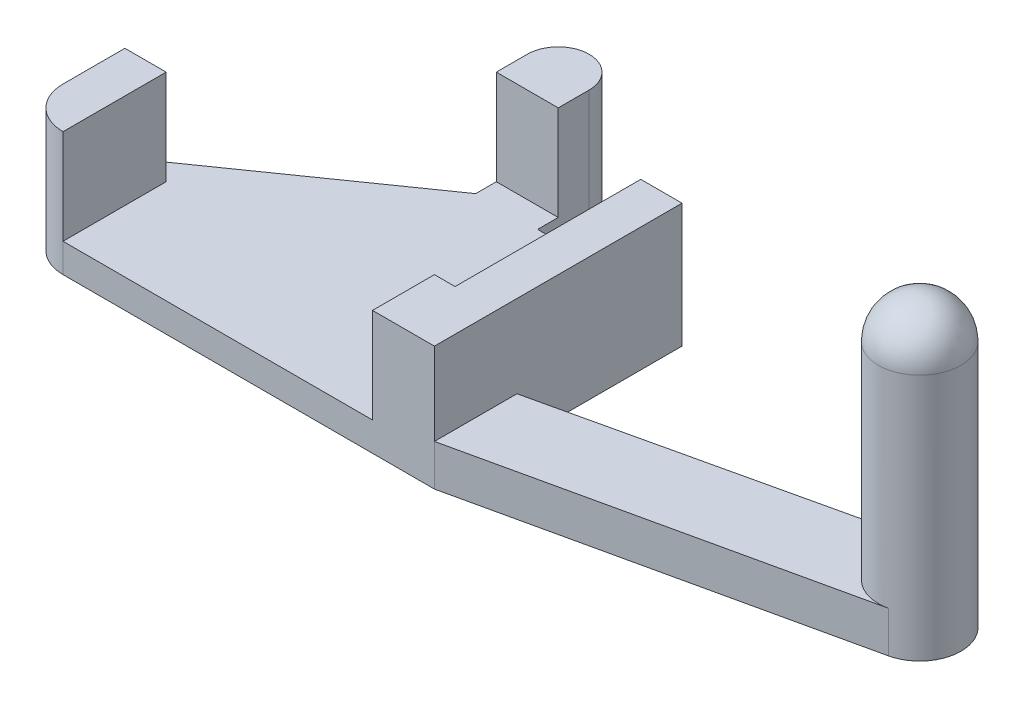
ISO-10303-21;
HEADER;
FILE_DESCRIPTION(('STEP AP214'),'2;1');
FILE_NAME('part.step','',(''),(''),'','','');
FILE_SCHEMA(('AUTOMOTIVE_DESIGN { 1 0 10303 214 1 1 1 1 }'));
ENDSEC;
DATA;
#1=APPLICATION_CONTEXT('core data for automotive mechanical design processes');
#2=APPLICATION_PROTOCOL_DEFINITION('international standard','automotive_design',2000,#1);
#3=PRODUCT_CONTEXT('',#1,'mechanical');
#4=PRODUCT('Part','Part','',(#3));
#5=PRODUCT_RELATED_PRODUCT_CATEGORY('part','',(#4));
#6=PRODUCT_DEFINITION_FORMATION('','',#4);
#7=PRODUCT_DEFINITION_CONTEXT('part definition',#1,'design');
#8=PRODUCT_DEFINITION('design','',#6,#7);
#9=PRODUCT_DEFINITION_SHAPE('','',#8);
#10=(LENGTH_UNIT() NAMED_UNIT(*) SI_UNIT(.MILLI.,.METRE.));
#11=(NAMED_UNIT(*) PLANE_ANGLE_UNIT() SI_UNIT($,.RADIAN.));
#12=(NAMED_UNIT(*) SI_UNIT($,.STERADIAN.) SOLID_ANGLE_UNIT());
#13=UNCERTAINTY_MEASURE_WITH_UNIT(LENGTH_MEASURE(1.E-05),#10,'distance_accuracy_value','');
#14=(GEOMETRIC_REPRESENTATION_CONTEXT(3) GLOBAL_UNCERTAINTY_ASSIGNED_CONTEXT((#13)) GLOBAL_UNIT_ASSIGNED_CONTEXT((#10,
#11,#12)) REPRESENTATION_CONTEXT('',''));
#15=CARTESIAN_POINT('',(0.,0.,0.));
#16=DIRECTION('',(0.,0.,1.));
#17=DIRECTION('',(1.,0.,0.));
#18=AXIS2_PLACEMENT_3D('',#15,#16,#17);
#19=CARTESIAN_POINT('',(-55.,0.,-50.));
#20=DIRECTION('',(0.,0.,1.));
#21=DIRECTION('',(1.,0.,0.));
#22=AXIS2_PLACEMENT_3D('',#19,#20,#21);
#23=PLANE('',#22);
#24=DIRECTION('',(0.,-1.,0.));
#25=VECTOR('',#24,1.);
#26=CARTESIAN_POINT('',(-80.,7.,-50.));
#27=LINE('',#26,#25);
#28=CARTESIAN_POINT('',(-80.,7.,-50.));
#29=VERTEX_POINT('',#28);
#30=CARTESIAN_POINT('',(-80.,0.,-50.));
#31=VERTEX_POINT('',#30);
#32=EDGE_CURVE('E55',#29,#31,#27,.T.);
#33=ORIENTED_EDGE('',*,*,#32,.F.);
#34=DIRECTION('',(1.,0.,0.));
#35=VECTOR('',#34,1.);
#36=CARTESIAN_POINT('',(-145.,7.,-50.));
#37=LINE('',#36,#35);
#38=CARTESIAN_POINT('',(-55.,7.,-50.));
#39=VERTEX_POINT('',#38);
#40=EDGE_CURVE('E233',#29,#39,#37,.T.);
#41=ORIENTED_EDGE('',*,*,#40,.T.);
#42=DIRECTION('',(0.,-1.,0.));
#43=VECTOR('',#42,1.);
#44=CARTESIAN_POINT('',(-55.,0.,-50.));
#45=LINE('',#44,#43);
#46=CARTESIAN_POINT('',(-55.,30.,-50.));
#47=VERTEX_POINT('',#46);
#48=EDGE_CURVE('E517',#47,#39,#45,.T.);
#49=ORIENTED_EDGE('',*,*,#48,.F.);
#50=DIRECTION('',(1.,0.,0.));
#51=VECTOR('',#50,1.);
#52=CARTESIAN_POINT('',(-55.,30.,-50.));
#53=LINE('',#52,#51);
#54=CARTESIAN_POINT('',(-45.,30.,-50.));
#55=VERTEX_POINT('',#54);
#56=EDGE_CURVE('E513',#47,#55,#53,.T.);
#57=ORIENTED_EDGE('',*,*,#56,.T.);
#58=DIRECTION('',(0.,-1.,0.));
#59=VECTOR('',#58,1.);
#60=CARTESIAN_POINT('',(-45.,0.,-50.));
#61=LINE('',#60,#59);
#62=CARTESIAN_POINT('',(-45.,0.,-50.));
#63=VERTEX_POINT('',#62);
#64=EDGE_CURVE('E523',#55,#63,#61,.T.);
#65=ORIENTED_EDGE('',*,*,#64,.T.);
#66=DIRECTION('',(1.,0.,0.));
#67=VECTOR('',#66,1.);
#68=CARTESIAN_POINT('',(-55.,0.,-50.));
#69=LINE('',#68,#67);
#70=EDGE_CURVE('E465',#31,#63,#69,.T.);
#71=ORIENTED_EDGE('',*,*,#70,.F.);
#72=EDGE_LOOP('',(#33,#41,#49,#57,#65,#71));
#73=FACE_BOUND('',#72,.T.);
#74=ADVANCED_FACE('F39',(#73),#23,.F.);
#75=CARTESIAN_POINT('',(-145.,7.,-50.));
#76=DIRECTION('',(0.,-1.,0.));
#77=DIRECTION('',(0.,0.,-1.));
#78=AXIS2_PLACEMENT_3D('',#75,#76,#77);
#79=PLANE('',#78);
#80=DIRECTION('',(0.,0.,1.));
#81=VECTOR('',#80,1.);
#82=CARTESIAN_POINT('',(-95.,7.,-55.));
#83=LINE('',#82,#81);
#84=CARTESIAN_POINT('',(-95.,7.,-55.));
#85=VERTEX_POINT('',#84);
#86=CARTESIAN_POINT('',(-95.,7.,-50.));
#87=VERTEX_POINT('',#86);
#88=EDGE_CURVE('E197',#85,#87,#83,.T.);
#89=ORIENTED_EDGE('',*,*,#88,.T.);
#90=DIRECTION('',(0.81923192051904,0.,-0.573462344363329));
#91=VECTOR('',#90,1.);
#92=CARTESIAN_POINT('',(-95.,7.,-50.));
#93=LINE('',#92,#91);
#94=CARTESIAN_POINT('',(-145.,7.,-15.));
#95=VERTEX_POINT('',#94);
#96=EDGE_CURVE('E63',#95,#87,#93,.T.);
#97=ORIENTED_EDGE('',*,*,#96,.F.);
#98=DIRECTION('',(-1.,0.,0.));
#99=VECTOR('',#98,1.);
#100=CARTESIAN_POINT('',(-145.,7.,-15.));
#101=LINE('',#100,#99);
#102=CARTESIAN_POINT('',(-135.,7.,-15.));
#103=VERTEX_POINT('',#102);
#104=EDGE_CURVE('E195',#103,#95,#101,.T.);
#105=ORIENTED_EDGE('',*,*,#104,.F.);
#106=DIRECTION('',(0.,0.,-1.));
#107=VECTOR('',#106,1.);
#108=CARTESIAN_POINT('',(-135.,7.,10.));
#109=LINE('',#108,#107);
#110=CARTESIAN_POINT('',(-135.,7.,10.));
#111=VERTEX_POINT('',#110);
#112=EDGE_CURVE('E210',#111,#103,#109,.T.);
#113=ORIENTED_EDGE('',*,*,#112,.F.);
#114=DIRECTION('',(1.,0.,0.));
#115=VECTOR('',#114,1.);
#116=CARTESIAN_POINT('',(-145.,7.,10.));
#117=LINE('',#116,#115);
#118=CARTESIAN_POINT('',(-60.,7.,10.));
#119=VERTEX_POINT('',#118);
#120=EDGE_CURVE('E240',#111,#119,#117,.T.);
#121=ORIENTED_EDGE('',*,*,#120,.T.);
#122=DIRECTION('',(0.,0.,1.));
#123=VECTOR('',#122,1.);
#124=CARTESIAN_POINT('',(-60.,7.,-4.99999999999998));
#125=LINE('',#124,#123);
#126=CARTESIAN_POINT('',(-60.,6.99999999999999,-4.99999999999998));
#127=VERTEX_POINT('',#126);
#128=EDGE_CURVE('E243',#127,#119,#125,.T.);
#129=ORIENTED_EDGE('',*,*,#128,.F.);
#130=DIRECTION('',(-1.,0.,0.));
#131=VECTOR('',#130,1.);
#132=CARTESIAN_POINT('',(-45.,7.,-4.99999999999999));
#133=LINE('',#132,#131);
#134=CARTESIAN_POINT('',(-55.,7.,-4.99999999999998));
#135=VERTEX_POINT('',#134);
#136=EDGE_CURVE('E356',#135,#127,#133,.T.);
#137=ORIENTED_EDGE('',*,*,#136,.F.);
#138=DIRECTION('',(0.,0.,-1.));
#139=VECTOR('',#138,1.);
#140=CARTESIAN_POINT('',(-55.,7.,-50.));
#141=LINE('',#140,#139);
#142=EDGE_CURVE('E234',#135,#39,#141,.T.);
#143=ORIENTED_EDGE('',*,*,#142,.T.);
#144=ORIENTED_EDGE('',*,*,#40,.F.);
#145=DIRECTION('',(0.,0.,1.));
#146=VECTOR('',#145,1.);
#147=CARTESIAN_POINT('',(-80.,7.,-55.));
#148=LINE('',#147,#146);
#149=CARTESIAN_POINT('',(-80.,7.00000000000001,-55.));
#150=VERTEX_POINT('',#149);
#151=EDGE_CURVE('E397',#150,#29,#148,.T.);
#152=ORIENTED_EDGE('',*,*,#151,.F.);
#153=DIRECTION('',(1.,0.,0.));
#154=VECTOR('',#153,1.);
#155=CARTESIAN_POINT('',(-80.,7.,-55.));
#156=LINE('',#155,#154);
#157=EDGE_CURVE('E410',#85,#150,#156,.T.);
#158=ORIENTED_EDGE('',*,*,#157,.F.);
#159=EDGE_LOOP('',(#89,#97,#105,#113,#121,#129,#137,#143,#144,#152,#158));
#160=FACE_BOUND('',#159,.T.);
#161=ADVANCED_FACE('F193',(#160),#79,.F.);
#162=CARTESIAN_POINT('',(-55.,0.,0.));
#163=DIRECTION('',(-1.,0.,0.));
#164=DIRECTION('',(0.,0.,1.));
#165=AXIS2_PLACEMENT_3D('',#162,#163,#164);
#166=PLANE('',#165);
#167=ORIENTED_EDGE('',*,*,#48,.T.);
#168=ORIENTED_EDGE('',*,*,#142,.F.);
#169=DIRECTION('',(0.,-1.,0.));
#170=VECTOR('',#169,1.);
#171=CARTESIAN_POINT('',(-55.,0.,-4.99999999999998));
#172=LINE('',#171,#170);
#173=CARTESIAN_POINT('',(-55.,30.,-4.99999999999999));
#174=VERTEX_POINT('',#173);
#175=EDGE_CURVE('E259',#174,#135,#172,.T.);
#176=ORIENTED_EDGE('',*,*,#175,.F.);
#177=DIRECTION('',(0.,0.,-1.));
#178=VECTOR('',#177,1.);
#179=CARTESIAN_POINT('',(-55.,30.,10.));
#180=LINE('',#179,#178);
#181=EDGE_CURVE('E511',#174,#47,#180,.T.);
#182=ORIENTED_EDGE('',*,*,#181,.T.);
#183=EDGE_LOOP('',(#167,#168,#176,#182));
#184=FACE_BOUND('',#183,.T.);
#185=ADVANCED_FACE('F312',(#184),#166,.T.);
#186=CARTESIAN_POINT('',(-60.,-21.2132034355964,-4.99999999999998));
#187=DIRECTION('',(-1.,0.,0.));
#188=DIRECTION('',(0.,0.,1.));
#189=AXIS2_PLACEMENT_3D('',#186,#187,#188);
#190=PLANE('',#189);
#191=DIRECTION('',(0.,1.,0.));
#192=VECTOR('',#191,1.);
#193=CARTESIAN_POINT('',(-60.,-21.2132034355964,-4.99999999999998));
#194=LINE('',#193,#192);
#195=CARTESIAN_POINT('',(-60.,30.,-4.99999999999999));
#196=VERTEX_POINT('',#195);
#197=EDGE_CURVE('E255',#127,#196,#194,.T.);
#198=ORIENTED_EDGE('',*,*,#197,.F.);
#199=ORIENTED_EDGE('',*,*,#128,.T.);
#200=DIRECTION('',(0.,1.,0.));
#201=VECTOR('',#200,1.);
#202=CARTESIAN_POINT('',(-60.,-21.2132034355964,10.));
#203=LINE('',#202,#201);
#204=CARTESIAN_POINT('',(-60.,30.,10.));
#205=VERTEX_POINT('',#204);
#206=EDGE_CURVE('E256',#119,#205,#203,.T.);
#207=ORIENTED_EDGE('',*,*,#206,.T.);
#208=DIRECTION('',(0.,0.,1.));
#209=VECTOR('',#208,1.);
#210=CARTESIAN_POINT('',(-60.,30.,-4.99999999999999));
#211=LINE('',#210,#209);
#212=EDGE_CURVE('E251',#196,#205,#211,.T.);
#213=ORIENTED_EDGE('',*,*,#212,.F.);
#214=EDGE_LOOP('',(#198,#199,#207,#213));
#215=FACE_BOUND('',#214,.T.);
#216=ADVANCED_FACE('F315',(#215),#190,.T.);
#217=CARTESIAN_POINT('',(-45.,-21.2132034355964,-4.99999999999998));
#218=DIRECTION('',(0.,0.,-1.));
#219=DIRECTION('',(0.,1.,0.));
#220=AXIS2_PLACEMENT_3D('',#217,#218,#219);
#221=PLANE('',#220);
#222=ORIENTED_EDGE('',*,*,#175,.T.);
#223=ORIENTED_EDGE('',*,*,#136,.T.);
#224=ORIENTED_EDGE('',*,*,#197,.T.);
#225=DIRECTION('',(-1.,0.,0.));
#226=VECTOR('',#225,1.);
#227=CARTESIAN_POINT('',(-45.,30.,-4.99999999999999));
#228=LINE('',#227,#226);
#229=EDGE_CURVE('E247',#174,#196,#228,.T.);
#230=ORIENTED_EDGE('',*,*,#229,.F.);
#231=EDGE_LOOP('',(#222,#223,#224,#230));
#232=FACE_BOUND('',#231,.T.);
#233=ADVANCED_FACE('F301',(#232),#221,.T.);
#234=CARTESIAN_POINT('',(40.6613908436269,10.,-29.5237412036791));
#235=DIRECTION('',(0.222218957224917,0.,0.974996787199768));
#236=DIRECTION('',(0.974996787199768,0.,-0.222218957224917));
#237=AXIS2_PLACEMENT_3D('',#234,#235,#236);
#238=PLANE('',#237);
#239=DIRECTION('',(0.,-1.,0.));
#240=VECTOR('',#239,1.);
#241=CARTESIAN_POINT('',(40.5556861544872,70.,-29.4996492414257));
#242=LINE('',#241,#240);
#243=CARTESIAN_POINT('',(40.5556861544874,0.,-29.4996492414257));
#244=VERTEX_POINT('',#243);
#245=CARTESIAN_POINT('',(40.5556861544872,10.,-29.4996492414257));
#246=VERTEX_POINT('',#245);
#247=EDGE_CURVE('E268',#244,#246,#242,.F.);
#248=ORIENTED_EDGE('',*,*,#247,.F.);
#249=DIRECTION('',(-0.974996787199768,0.,0.222218957224917));
#250=VECTOR('',#249,1.);
#251=CARTESIAN_POINT('',(40.6613908436269,0.,-29.5237412036791));
#252=LINE('',#251,#250);
#253=CARTESIAN_POINT('',(-45.,0.,-9.99999999999999));
#254=VERTEX_POINT('',#253);
#255=EDGE_CURVE('E341',#244,#254,#252,.T.);
#256=ORIENTED_EDGE('',*,*,#255,.T.);
#257=DIRECTION('',(0.,-1.,0.));
#258=VECTOR('',#257,1.);
#259=CARTESIAN_POINT('',(-45.,10.,-10.));
#260=LINE('',#259,#258);
#261=CARTESIAN_POINT('',(-45.,10.,-10.));
#262=VERTEX_POINT('',#261);
#263=EDGE_CURVE('E543',#262,#254,#260,.T.);
#264=ORIENTED_EDGE('',*,*,#263,.F.);
#265=DIRECTION('',(-0.974996787199768,0.,0.222218957224917));
#266=VECTOR('',#265,1.);
#267=CARTESIAN_POINT('',(40.6613908436269,10.,-29.5237412036791));
#268=LINE('',#267,#266);
#269=EDGE_CURVE('E531',#246,#262,#268,.T.);
#270=ORIENTED_EDGE('',*,*,#269,.F.);
#271=EDGE_LOOP('',(#248,#256,#264,#270));
#272=FACE_BOUND('',#271,.T.);
#273=ADVANCED_FACE('F307',(#272),#238,.F.);
#274=CARTESIAN_POINT('',(-45.,10.,10.));
#275=DIRECTION('',(0.,0.,-1.));
#276=DIRECTION('',(-1.,0.,0.));
#277=AXIS2_PLACEMENT_3D('',#274,#275,#276);
#278=PLANE('',#277);
#279=ORIENTED_EDGE('',*,*,#120,.F.);
#280=DIRECTION('',(0.,1.,0.));
#281=VECTOR('',#280,1.);
#282=CARTESIAN_POINT('',(-135.,10.,10.));
#283=LINE('',#282,#281);
#284=CARTESIAN_POINT('',(-135.,0.,10.));
#285=VERTEX_POINT('',#284);
#286=EDGE_CURVE('E48',#111,#285,#283,.F.);
#287=ORIENTED_EDGE('',*,*,#286,.T.);
#288=DIRECTION('',(1.,0.,0.));
#289=VECTOR('',#288,1.);
#290=CARTESIAN_POINT('',(-45.,0.,10.));
#291=LINE('',#290,#289);
#292=CARTESIAN_POINT('',(-45.,0.,10.));
#293=VERTEX_POINT('',#292);
#294=EDGE_CURVE('E372',#285,#293,#291,.T.);
#295=ORIENTED_EDGE('',*,*,#294,.T.);
#296=DIRECTION('',(0.,-1.,0.));
#297=VECTOR('',#296,1.);
#298=CARTESIAN_POINT('',(-45.,10.,10.));
#299=LINE('',#298,#297);
#300=CARTESIAN_POINT('',(-45.,10.,10.));
#301=VERTEX_POINT('',#300);
#302=EDGE_CURVE('E349',#301,#293,#299,.T.);
#303=ORIENTED_EDGE('',*,*,#302,.F.);
#304=DIRECTION('',(0.,1.,0.));
#305=VECTOR('',#304,1.);
#306=CARTESIAN_POINT('',(-45.,0.,10.));
#307=LINE('',#306,#305);
#308=CARTESIAN_POINT('',(-45.,30.,10.));
#309=VERTEX_POINT('',#308);
#310=EDGE_CURVE('E527',#301,#309,#307,.T.);
#311=ORIENTED_EDGE('',*,*,#310,.T.);
#312=DIRECTION('',(1.,0.,0.));
#313=VECTOR('',#312,1.);
#314=CARTESIAN_POINT('',(-55.,30.,10.));
#315=LINE('',#314,#313);
#316=EDGE_CURVE('E384',#205,#309,#315,.T.);
#317=ORIENTED_EDGE('',*,*,#316,.F.);
#318=ORIENTED_EDGE('',*,*,#206,.F.);
#319=EDGE_LOOP('',(#279,#287,#295,#303,#311,#317,#318));
#320=FACE_BOUND('',#319,.T.);
#321=ADVANCED_FACE('F310',(#320),#278,.F.);
#322=CARTESIAN_POINT('',(0.,10.,0.));
#323=DIRECTION('',(0.,1.,0.));
#324=DIRECTION('',(0.,0.,1.));
#325=AXIS2_PLACEMENT_3D('',#322,#323,#324);
#326=PLANE('',#325);
#327=DIRECTION('',(-0.976187060183953,0.,0.216930457818656));
#328=VECTOR('',#327,1.);
#329=CARTESIAN_POINT('',(-45.,10.,10.));
#330=LINE('',#329,#328);
#331=CARTESIAN_POINT('',(45.,10.,-10.));
#332=VERTEX_POINT('',#331);
#333=EDGE_CURVE('E286',#332,#301,#330,.T.);
#334=ORIENTED_EDGE('',*,*,#333,.F.);
#335=CARTESIAN_POINT('',(42.8306954218134,10.,-19.7618706018395));
#336=DIRECTION('',(0.,1.,0.));
#337=DIRECTION('',(0.,0.,1.));
#338=AXIS2_PLACEMENT_3D('',#335,#336,#337);
#339=CIRCLE('',#338,10.);
#340=EDGE_CURVE('E275',#332,#246,#339,.F.);
#341=ORIENTED_EDGE('',*,*,#340,.T.);
#342=ORIENTED_EDGE('',*,*,#269,.T.);
#343=DIRECTION('',(0.,0.,1.));
#344=VECTOR('',#343,1.);
#345=CARTESIAN_POINT('',(-45.,10.,-10.));
#346=LINE('',#345,#344);
#347=EDGE_CURVE('E383',#262,#301,#346,.T.);
#348=ORIENTED_EDGE('',*,*,#347,.T.);
#349=EDGE_LOOP('',(#334,#341,#342,#348));
#350=FACE_BOUND('',#349,.T.);
#351=ADVANCED_FACE('F327',(#350),#326,.T.);
#352=CARTESIAN_POINT('',(0.,0.,0.));
#353=DIRECTION('',(0.,1.,0.));
#354=DIRECTION('',(0.,0.,1.));
#355=AXIS2_PLACEMENT_3D('',#352,#353,#354);
#356=PLANE('',#355);
#357=DIRECTION('',(0.,0.,1.));
#358=VECTOR('',#357,1.);
#359=CARTESIAN_POINT('',(-145.,0.,-50.));
#360=LINE('',#359,#358);
#361=CARTESIAN_POINT('',(-145.,0.,-15.));
#362=VERTEX_POINT('',#361);
#363=CARTESIAN_POINT('',(-145.,0.,0.));
#364=VERTEX_POINT('',#363);
#365=EDGE_CURVE('E230',#362,#364,#360,.T.);
#366=ORIENTED_EDGE('',*,*,#365,.F.);
#367=DIRECTION('',(0.81923192051904,0.,-0.573462344363329));
#368=VECTOR('',#367,1.);
#369=CARTESIAN_POINT('',(-54.7315436241611,0.,-78.1879194630872));
#370=LINE('',#369,#368);
#371=CARTESIAN_POINT('',(-95.,0.,-50.));
#372=VERTEX_POINT('',#371);
#373=EDGE_CURVE('E184',#362,#372,#370,.T.);
#374=ORIENTED_EDGE('',*,*,#373,.T.);
#375=DIRECTION('',(0.,0.,1.));
#376=VECTOR('',#375,1.);
#377=CARTESIAN_POINT('',(-95.,0.,-55.));
#378=LINE('',#377,#376);
#379=CARTESIAN_POINT('',(-95.,0.,-62.5));
#380=VERTEX_POINT('',#379);
#381=EDGE_CURVE('E406',#380,#372,#378,.T.);
#382=ORIENTED_EDGE('',*,*,#381,.F.);
#383=CARTESIAN_POINT('',(-87.5,0.,-62.5));
#384=DIRECTION('',(0.,1.,0.));
#385=DIRECTION('',(0.,0.,1.));
#386=AXIS2_PLACEMENT_3D('',#383,#384,#385);
#387=CIRCLE('',#386,7.50000000000001);
#388=CARTESIAN_POINT('',(-80.,0.,-62.5));
#389=VERTEX_POINT('',#388);
#390=EDGE_CURVE('E441',#389,#380,#387,.T.);
#391=ORIENTED_EDGE('',*,*,#390,.F.);
#392=DIRECTION('',(0.,0.,1.));
#393=VECTOR('',#392,1.);
#394=CARTESIAN_POINT('',(-80.,0.,-55.));
#395=LINE('',#394,#393);
#396=EDGE_CURVE('E400',#389,#31,#395,.T.);
#397=ORIENTED_EDGE('',*,*,#396,.T.);
#398=ORIENTED_EDGE('',*,*,#70,.T.);
#399=DIRECTION('',(0.,0.,1.));
#400=VECTOR('',#399,1.);
#401=CARTESIAN_POINT('',(-45.,0.,10.));
#402=LINE('',#401,#400);
#403=EDGE_CURVE('E518',#63,#254,#402,.T.);
#404=ORIENTED_EDGE('',*,*,#403,.T.);
#405=ORIENTED_EDGE('',*,*,#255,.F.);
#406=CARTESIAN_POINT('',(42.8306954218134,0.,-19.7618706018395));
#407=DIRECTION('',(0.,1.,0.));
#408=DIRECTION('',(-0.216930457818566,0.,-0.976187060183973));
#409=AXIS2_PLACEMENT_3D('',#406,#407,#408);
#410=CIRCLE('',#409,10.);
#411=CARTESIAN_POINT('',(40.6613908436269,0.,-29.5237412036791));
#412=VERTEX_POINT('',#411);
#413=EDGE_CURVE('E281',#412,#244,#410,.T.);
#414=ORIENTED_EDGE('',*,*,#413,.F.);
#415=CARTESIAN_POINT('',(42.8306954218134,0.,-19.7618706018395));
#416=DIRECTION('',(0.,1.,0.));
#417=DIRECTION('',(0.,0.,1.));
#418=AXIS2_PLACEMENT_3D('',#415,#416,#417);
#419=CIRCLE('',#418,10.);
#420=CARTESIAN_POINT('',(45.,0.,-10.));
#421=VERTEX_POINT('',#420);
#422=EDGE_CURVE('E265',#421,#412,#419,.T.);
#423=ORIENTED_EDGE('',*,*,#422,.F.);
#424=DIRECTION('',(-0.976187060183953,0.,0.216930457818656));
#425=VECTOR('',#424,1.);
#426=CARTESIAN_POINT('',(-45.,0.,10.));
#427=LINE('',#426,#425);
#428=EDGE_CURVE('E381',#421,#293,#427,.T.);
#429=ORIENTED_EDGE('',*,*,#428,.T.);
#430=ORIENTED_EDGE('',*,*,#294,.F.);
#431=CARTESIAN_POINT('',(-135.,0.,0.));
#432=DIRECTION('',(0.,1.,0.));
#433=DIRECTION('',(0.,0.,1.));
#434=AXIS2_PLACEMENT_3D('',#431,#432,#433);
#435=CIRCLE('',#434,10.);
#436=EDGE_CURVE('E11',#285,#364,#435,.F.);
#437=ORIENTED_EDGE('',*,*,#436,.T.);
#438=EDGE_LOOP('',(#366,#374,#382,#391,#397,#398,#404,#405,#414,#423,#429,#430,#437));
#439=FACE_BOUND('',#438,.T.);
#440=ADVANCED_FACE('F325',(#439),#356,.F.);
#441=CARTESIAN_POINT('',(-55.,30.,10.));
#442=DIRECTION('',(0.,-1.,0.));
#443=DIRECTION('',(0.,0.,-1.));
#444=AXIS2_PLACEMENT_3D('',#441,#442,#443);
#445=PLANE('',#444);
#446=ORIENTED_EDGE('',*,*,#181,.F.);
#447=ORIENTED_EDGE('',*,*,#229,.T.);
#448=ORIENTED_EDGE('',*,*,#212,.T.);
#449=ORIENTED_EDGE('',*,*,#316,.T.);
#450=DIRECTION('',(0.,0.,-1.));
#451=VECTOR('',#450,1.);
#452=CARTESIAN_POINT('',(-45.,30.,10.));
#453=LINE('',#452,#451);
#454=EDGE_CURVE('E530',#309,#55,#453,.T.);
#455=ORIENTED_EDGE('',*,*,#454,.T.);
#456=ORIENTED_EDGE('',*,*,#56,.F.);
#457=EDGE_LOOP('',(#446,#447,#448,#449,#455,#456));
#458=FACE_BOUND('',#457,.T.);
#459=ADVANCED_FACE('F319',(#458),#445,.F.);
#460=CARTESIAN_POINT('',(-45.,0.,0.));
#461=DIRECTION('',(-1.,0.,0.));
#462=DIRECTION('',(0.,0.,1.));
#463=AXIS2_PLACEMENT_3D('',#460,#461,#462);
#464=PLANE('',#463);
#465=ORIENTED_EDGE('',*,*,#64,.F.);
#466=ORIENTED_EDGE('',*,*,#454,.F.);
#467=ORIENTED_EDGE('',*,*,#310,.F.);
#468=ORIENTED_EDGE('',*,*,#347,.F.);
#469=ORIENTED_EDGE('',*,*,#263,.T.);
#470=ORIENTED_EDGE('',*,*,#403,.F.);
#471=EDGE_LOOP('',(#465,#466,#467,#468,#469,#470));
#472=FACE_BOUND('',#471,.T.);
#473=ADVANCED_FACE('F305',(#472),#464,.F.);
#474=CARTESIAN_POINT('',(-45.,10.,10.));
#475=DIRECTION('',(0.216930457818656,0.,0.976187060183953));
#476=DIRECTION('',(0.976187060183953,0.,-0.216930457818656));
#477=AXIS2_PLACEMENT_3D('',#474,#475,#476);
#478=PLANE('',#477);
#479=ORIENTED_EDGE('',*,*,#428,.F.);
#480=DIRECTION('',(0.,-1.,0.));
#481=VECTOR('',#480,1.);
#482=CARTESIAN_POINT('',(45.,10.,-10.));
#483=LINE('',#482,#481);
#484=EDGE_CURVE('E357',#332,#421,#483,.T.);
#485=ORIENTED_EDGE('',*,*,#484,.F.);
#486=ORIENTED_EDGE('',*,*,#333,.T.);
#487=ORIENTED_EDGE('',*,*,#302,.T.);
#488=EDGE_LOOP('',(#479,#485,#486,#487));
#489=FACE_BOUND('',#488,.T.);
#490=ADVANCED_FACE('F299',(#489),#478,.T.);
#491=CARTESIAN_POINT('',(42.8306954218134,70.,-19.7618706018395));
#492=DIRECTION('',(0.,-1.,0.));
#493=DIRECTION('',(0.,0.,-1.));
#494=AXIS2_PLACEMENT_3D('',#491,#492,#493);
#495=CYLINDRICAL_SURFACE('',#494,10.);
#496=CARTESIAN_POINT('',(42.8306954218134,60.,-19.7618706018395));
#497=DIRECTION('',(0.,-1.,0.));
#498=DIRECTION('',(0.,0.,-1.));
#499=AXIS2_PLACEMENT_3D('',#496,#497,#498);
#500=CIRCLE('',#499,10.);
#501=CARTESIAN_POINT('',(42.8306954218134,60.,-29.7618706018395));
#502=VERTEX_POINT('',#501);
#503=EDGE_CURVE('E352',#502,#502,#500,.T.);
#504=ORIENTED_EDGE('',*,*,#503,.T.);
#505=EDGE_LOOP('',(#504));
#506=FACE_BOUND('',#505,.T.);
#507=ORIENTED_EDGE('',*,*,#247,.T.);
#508=ORIENTED_EDGE('',*,*,#340,.F.);
#509=ORIENTED_EDGE('',*,*,#484,.T.);
#510=ORIENTED_EDGE('',*,*,#422,.T.);
#511=ORIENTED_EDGE('',*,*,#413,.T.);
#512=EDGE_LOOP('',(#507,#508,#509,#510,#511));
#513=FACE_BOUND('',#512,.T.);
#514=ADVANCED_FACE('F288',(#506,#513),#495,.T.);
#515=CARTESIAN_POINT('',(42.8306954218134,60.,-19.7618706018395));
#516=DIRECTION('',(0.,1.,0.));
#517=DIRECTION('',(0.,0.,1.));
#518=AXIS2_PLACEMENT_3D('',#515,#516,#517);
#519=SPHERICAL_SURFACE('',#518,10.);
#520=ORIENTED_EDGE('',*,*,#503,.F.);
#521=EDGE_LOOP('',(#520));
#522=FACE_BOUND('',#521,.T.);
#523=ADVANCED_FACE('F298',(#522),#519,.T.);
#524=CARTESIAN_POINT('',(-145.,0.,0.));
#525=DIRECTION('',(1.,0.,0.));
#526=DIRECTION('',(0.,0.,-1.));
#527=AXIS2_PLACEMENT_3D('',#524,#525,#526);
#528=PLANE('',#527);
#529=DIRECTION('',(0.,-1.,0.));
#530=VECTOR('',#529,1.);
#531=CARTESIAN_POINT('',(-145.,56.9258240356725,-15.));
#532=LINE('',#531,#530);
#533=CARTESIAN_POINT('',(-145.,30.,-15.));
#534=VERTEX_POINT('',#533);
#535=EDGE_CURVE('E205',#534,#95,#532,.T.);
#536=ORIENTED_EDGE('',*,*,#535,.T.);
#537=DIRECTION('',(0.,1.,0.));
#538=VECTOR('',#537,1.);
#539=CARTESIAN_POINT('',(-145.,-0.00109529660358588,-15.));
#540=LINE('',#539,#538);
#541=EDGE_CURVE('E181',#362,#95,#540,.T.);
#542=ORIENTED_EDGE('',*,*,#541,.F.);
#543=ORIENTED_EDGE('',*,*,#365,.T.);
#544=DIRECTION('',(0.,1.,0.));
#545=VECTOR('',#544,1.);
#546=CARTESIAN_POINT('',(-145.,0.,0.));
#547=LINE('',#546,#545);
#548=CARTESIAN_POINT('',(-145.,30.,0.));
#549=VERTEX_POINT('',#548);
#550=EDGE_CURVE('E361',#364,#549,#547,.T.);
#551=ORIENTED_EDGE('',*,*,#550,.T.);
#552=DIRECTION('',(0.,0.,-1.));
#553=VECTOR('',#552,1.);
#554=CARTESIAN_POINT('',(-145.,30.,10.));
#555=LINE('',#554,#553);
#556=EDGE_CURVE('E215',#549,#534,#555,.T.);
#557=ORIENTED_EDGE('',*,*,#556,.T.);
#558=EDGE_LOOP('',(#536,#542,#543,#551,#557));
#559=FACE_BOUND('',#558,.T.);
#560=ADVANCED_FACE('F212',(#559),#528,.F.);
#561=CARTESIAN_POINT('',(-145.,56.9258240356725,-15.));
#562=DIRECTION('',(0.,0.,1.));
#563=DIRECTION('',(1.,0.,0.));
#564=AXIS2_PLACEMENT_3D('',#561,#562,#563);
#565=PLANE('',#564);
#566=ORIENTED_EDGE('',*,*,#535,.F.);
#567=DIRECTION('',(1.,0.,0.));
#568=VECTOR('',#567,1.);
#569=CARTESIAN_POINT('',(-145.,30.,-15.));
#570=LINE('',#569,#568);
#571=CARTESIAN_POINT('',(-135.,30.,-15.));
#572=VERTEX_POINT('',#571);
#573=EDGE_CURVE('E226',#534,#572,#570,.T.);
#574=ORIENTED_EDGE('',*,*,#573,.T.);
#575=DIRECTION('',(0.,-1.,0.));
#576=VECTOR('',#575,1.);
#577=CARTESIAN_POINT('',(-135.,56.9258240356725,-15.));
#578=LINE('',#577,#576);
#579=EDGE_CURVE('E207',#572,#103,#578,.T.);
#580=ORIENTED_EDGE('',*,*,#579,.T.);
#581=ORIENTED_EDGE('',*,*,#104,.T.);
#582=EDGE_LOOP('',(#566,#574,#580,#581));
#583=FACE_BOUND('',#582,.T.);
#584=ADVANCED_FACE('F203',(#583),#565,.F.);
#585=CARTESIAN_POINT('',(-135.,56.9258240356725,10.));
#586=DIRECTION('',(-1.,0.,0.));
#587=DIRECTION('',(0.,0.,1.));
#588=AXIS2_PLACEMENT_3D('',#585,#586,#587);
#589=PLANE('',#588);
#590=ORIENTED_EDGE('',*,*,#579,.F.);
#591=DIRECTION('',(0.,0.,1.));
#592=VECTOR('',#591,1.);
#593=CARTESIAN_POINT('',(-135.,30.,10.));
#594=LINE('',#593,#592);
#595=CARTESIAN_POINT('',(-135.,30.,10.));
#596=VERTEX_POINT('',#595);
#597=EDGE_CURVE('E229',#572,#596,#594,.T.);
#598=ORIENTED_EDGE('',*,*,#597,.T.);
#599=DIRECTION('',(0.,-1.,0.));
#600=VECTOR('',#599,1.);
#601=CARTESIAN_POINT('',(-135.,56.9258240356725,10.));
#602=LINE('',#601,#600);
#603=EDGE_CURVE('E220',#596,#111,#602,.T.);
#604=ORIENTED_EDGE('',*,*,#603,.T.);
#605=ORIENTED_EDGE('',*,*,#112,.T.);
#606=EDGE_LOOP('',(#590,#598,#604,#605));
#607=FACE_BOUND('',#606,.T.);
#608=ADVANCED_FACE('F491',(#607),#589,.F.);
#609=CARTESIAN_POINT('',(-55.,30.,10.));
#610=DIRECTION('',(0.,-1.,0.));
#611=DIRECTION('',(0.,0.,-1.));
#612=AXIS2_PLACEMENT_3D('',#609,#610,#611);
#613=PLANE('',#612);
#614=ORIENTED_EDGE('',*,*,#556,.F.);
#615=CARTESIAN_POINT('',(-135.,30.,0.));
#616=DIRECTION('',(0.,-1.,0.));
#617=DIRECTION('',(0.,0.,-1.));
#618=AXIS2_PLACEMENT_3D('',#615,#616,#617);
#619=CIRCLE('',#618,10.);
#620=EDGE_CURVE('E364',#549,#596,#619,.F.);
#621=ORIENTED_EDGE('',*,*,#620,.T.);
#622=ORIENTED_EDGE('',*,*,#597,.F.);
#623=ORIENTED_EDGE('',*,*,#573,.F.);
#624=EDGE_LOOP('',(#614,#621,#622,#623));
#625=FACE_BOUND('',#624,.T.);
#626=ADVANCED_FACE('F387',(#625),#613,.F.);
#627=CARTESIAN_POINT('',(-135.,0.,0.));
#628=DIRECTION('',(0.,1.,0.));
#629=DIRECTION('',(0.,0.,1.));
#630=AXIS2_PLACEMENT_3D('',#627,#628,#629);
#631=CYLINDRICAL_SURFACE('',#630,10.);
#632=ORIENTED_EDGE('',*,*,#286,.F.);
#633=ORIENTED_EDGE('',*,*,#603,.F.);
#634=ORIENTED_EDGE('',*,*,#620,.F.);
#635=ORIENTED_EDGE('',*,*,#550,.F.);
#636=ORIENTED_EDGE('',*,*,#436,.F.);
#637=EDGE_LOOP('',(#632,#633,#634,#635,#636));
#638=FACE_BOUND('',#637,.T.);
#639=ADVANCED_FACE('F41',(#638),#631,.T.);
#640=CARTESIAN_POINT('',(-95.,7.,-55.));
#641=DIRECTION('',(1.,0.,0.));
#642=DIRECTION('',(0.,0.,-1.));
#643=AXIS2_PLACEMENT_3D('',#640,#641,#642);
#644=PLANE('',#643);
#645=DIRECTION('',(0.,1.,0.));
#646=VECTOR('',#645,1.);
#647=CARTESIAN_POINT('',(-95.,7.,-50.));
#648=LINE('',#647,#646);
#649=EDGE_CURVE('E413',#372,#87,#648,.T.);
#650=ORIENTED_EDGE('',*,*,#649,.T.);
#651=ORIENTED_EDGE('',*,*,#88,.F.);
#652=DIRECTION('',(0.,-1.,0.));
#653=VECTOR('',#652,1.);
#654=CARTESIAN_POINT('',(-95.,51.2132034355964,-55.));
#655=LINE('',#654,#653);
#656=CARTESIAN_POINT('',(-95.,30.,-55.));
#657=VERTEX_POINT('',#656);
#658=EDGE_CURVE('E429',#657,#85,#655,.T.);
#659=ORIENTED_EDGE('',*,*,#658,.F.);
#660=DIRECTION('',(0.,0.,-1.));
#661=VECTOR('',#660,1.);
#662=CARTESIAN_POINT('',(-95.,30.,-55.));
#663=LINE('',#662,#661);
#664=CARTESIAN_POINT('',(-95.,30.,-62.5));
#665=VERTEX_POINT('',#664);
#666=EDGE_CURVE('E448',#657,#665,#663,.T.);
#667=ORIENTED_EDGE('',*,*,#666,.T.);
#668=DIRECTION('',(0.,-1.,0.));
#669=VECTOR('',#668,1.);
#670=CARTESIAN_POINT('',(-95.,51.2132034355964,-62.5));
#671=LINE('',#670,#669);
#672=EDGE_CURVE('E425',#665,#380,#671,.T.);
#673=ORIENTED_EDGE('',*,*,#672,.T.);
#674=ORIENTED_EDGE('',*,*,#381,.T.);
#675=EDGE_LOOP('',(#650,#651,#659,#667,#673,#674));
#676=FACE_BOUND('',#675,.T.);
#677=ADVANCED_FACE('F458',(#676),#644,.F.);
#678=CARTESIAN_POINT('',(-80.,7.,-55.));
#679=DIRECTION('',(-1.,0.,0.));
#680=DIRECTION('',(0.,0.,1.));
#681=AXIS2_PLACEMENT_3D('',#678,#679,#680);
#682=PLANE('',#681);
#683=ORIENTED_EDGE('',*,*,#32,.T.);
#684=ORIENTED_EDGE('',*,*,#396,.F.);
#685=DIRECTION('',(0.,-1.,0.));
#686=VECTOR('',#685,1.);
#687=CARTESIAN_POINT('',(-80.,51.2132034355964,-62.5));
#688=LINE('',#687,#686);
#689=CARTESIAN_POINT('',(-80.,30.,-62.5));
#690=VERTEX_POINT('',#689);
#691=EDGE_CURVE('E437',#690,#389,#688,.T.);
#692=ORIENTED_EDGE('',*,*,#691,.F.);
#693=DIRECTION('',(0.,0.,1.));
#694=VECTOR('',#693,1.);
#695=CARTESIAN_POINT('',(-80.,30.,-62.5));
#696=LINE('',#695,#694);
#697=CARTESIAN_POINT('',(-80.,30.,-55.));
#698=VERTEX_POINT('',#697);
#699=EDGE_CURVE('E420',#690,#698,#696,.T.);
#700=ORIENTED_EDGE('',*,*,#699,.T.);
#701=DIRECTION('',(0.,-1.,0.));
#702=VECTOR('',#701,1.);
#703=CARTESIAN_POINT('',(-80.,51.2132034355964,-55.));
#704=LINE('',#703,#702);
#705=EDGE_CURVE('E433',#698,#150,#704,.T.);
#706=ORIENTED_EDGE('',*,*,#705,.T.);
#707=ORIENTED_EDGE('',*,*,#151,.T.);
#708=EDGE_LOOP('',(#683,#684,#692,#700,#706,#707));
#709=FACE_BOUND('',#708,.T.);
#710=ADVANCED_FACE('F468',(#709),#682,.F.);
#711=CARTESIAN_POINT('',(-95.,51.2132034355964,-55.));
#712=DIRECTION('',(0.,0.,-1.));
#713=DIRECTION('',(-1.,0.,0.));
#714=AXIS2_PLACEMENT_3D('',#711,#712,#713);
#715=PLANE('',#714);
#716=ORIENTED_EDGE('',*,*,#658,.T.);
#717=ORIENTED_EDGE('',*,*,#157,.T.);
#718=ORIENTED_EDGE('',*,*,#705,.F.);
#719=DIRECTION('',(-1.,0.,0.));
#720=VECTOR('',#719,1.);
#721=CARTESIAN_POINT('',(-95.,30.,-55.));
#722=LINE('',#721,#720);
#723=EDGE_CURVE('E424',#698,#657,#722,.T.);
#724=ORIENTED_EDGE('',*,*,#723,.T.);
#725=EDGE_LOOP('',(#716,#717,#718,#724));
#726=FACE_BOUND('',#725,.T.);
#727=ADVANCED_FACE('F471',(#726),#715,.F.);
#728=CARTESIAN_POINT('',(-87.5,51.2132034355964,-62.5));
#729=DIRECTION('',(0.,-1.,0.));
#730=DIRECTION('',(0.,0.,-1.));
#731=AXIS2_PLACEMENT_3D('',#728,#729,#730);
#732=CYLINDRICAL_SURFACE('',#731,7.50000000000001);
#733=ORIENTED_EDGE('',*,*,#672,.F.);
#734=CARTESIAN_POINT('',(-87.5,30.,-62.5));
#735=DIRECTION('',(0.,-1.,0.));
#736=DIRECTION('',(0.,0.,-1.));
#737=AXIS2_PLACEMENT_3D('',#734,#735,#736);
#738=CIRCLE('',#737,7.50000000000001);
#739=EDGE_CURVE('E416',#665,#690,#738,.T.);
#740=ORIENTED_EDGE('',*,*,#739,.T.);
#741=ORIENTED_EDGE('',*,*,#691,.T.);
#742=ORIENTED_EDGE('',*,*,#390,.T.);
#743=EDGE_LOOP('',(#733,#740,#741,#742));
#744=FACE_BOUND('',#743,.T.);
#745=ADVANCED_FACE('F462',(#744),#732,.T.);
#746=CARTESIAN_POINT('',(-55.,30.,10.));
#747=DIRECTION('',(0.,-1.,0.));
#748=DIRECTION('',(0.,0.,-1.));
#749=AXIS2_PLACEMENT_3D('',#746,#747,#748);
#750=PLANE('',#749);
#751=ORIENTED_EDGE('',*,*,#666,.F.);
#752=ORIENTED_EDGE('',*,*,#723,.F.);
#753=ORIENTED_EDGE('',*,*,#699,.F.);
#754=ORIENTED_EDGE('',*,*,#739,.F.);
#755=EDGE_LOOP('',(#751,#752,#753,#754));
#756=FACE_BOUND('',#755,.T.);
#757=ADVANCED_FACE('F473',(#756),#750,.F.);
#758=CARTESIAN_POINT('',(-95.,-0.00109529660358588,-50.));
#759=DIRECTION('',(0.573462344363329,0.,0.81923192051904));
#760=DIRECTION('',(0.81923192051904,0.,-0.573462344363329));
#761=AXIS2_PLACEMENT_3D('',#758,#759,#760);
#762=PLANE('',#761);
#763=ORIENTED_EDGE('',*,*,#541,.T.);
#764=ORIENTED_EDGE('',*,*,#96,.T.);
#765=ORIENTED_EDGE('',*,*,#649,.F.);
#766=ORIENTED_EDGE('',*,*,#373,.F.);
#767=EDGE_LOOP('',(#763,#764,#765,#766));
#768=FACE_BOUND('',#767,.T.);
#769=ADVANCED_FACE('F182',(#768),#762,.F.);
#770=CLOSED_SHELL('',(#74,#161,#185,#216,#233,#273,#321,#351,#440,#459,#473,#490,#514,#523,#560,
#584,#608,#626,#639,#677,#710,#727,#745,#757,#769));
#771=MANIFOLD_SOLID_BREP('B2',#770);
#772=ADVANCED_BREP_SHAPE_REPRESENTATION('',(#18,#771),#14);
#773=SHAPE_DEFINITION_REPRESENTATION(#9,#772);
ENDSEC;
END-ISO-10303-21;
